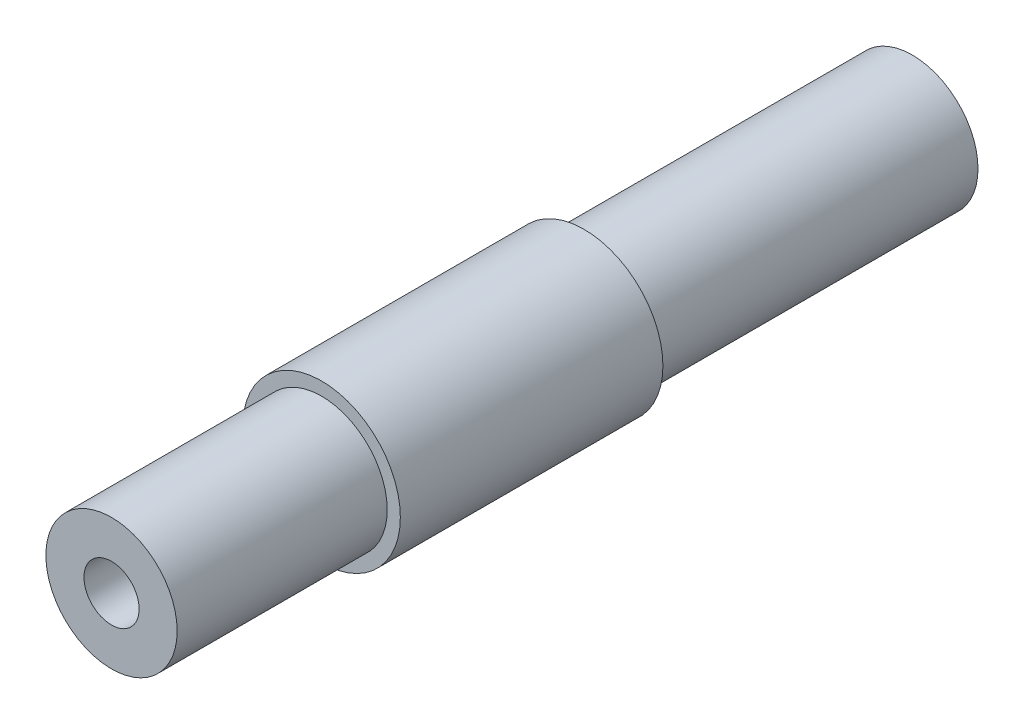
ISO-10303-21;
HEADER;
FILE_DESCRIPTION(('STEP AP214'),'2;1');
FILE_NAME('part.step','',(''),(''),'','','');
FILE_SCHEMA(('AUTOMOTIVE_DESIGN { 1 0 10303 214 1 1 1 1 }'));
ENDSEC;
DATA;
#1=APPLICATION_CONTEXT('core data for automotive mechanical design processes');
#2=APPLICATION_PROTOCOL_DEFINITION('international standard','automotive_design',2000,#1);
#3=PRODUCT_CONTEXT('',#1,'mechanical');
#4=PRODUCT('Part','Part','',(#3));
#5=PRODUCT_RELATED_PRODUCT_CATEGORY('part','',(#4));
#6=PRODUCT_DEFINITION_FORMATION('','',#4);
#7=PRODUCT_DEFINITION_CONTEXT('part definition',#1,'design');
#8=PRODUCT_DEFINITION('design','',#6,#7);
#9=PRODUCT_DEFINITION_SHAPE('','',#8);
#10=(LENGTH_UNIT() NAMED_UNIT(*) SI_UNIT(.MILLI.,.METRE.));
#11=(NAMED_UNIT(*) PLANE_ANGLE_UNIT() SI_UNIT($,.RADIAN.));
#12=(NAMED_UNIT(*) SI_UNIT($,.STERADIAN.) SOLID_ANGLE_UNIT());
#13=UNCERTAINTY_MEASURE_WITH_UNIT(LENGTH_MEASURE(1.E-05),#10,'distance_accuracy_value','');
#14=(GEOMETRIC_REPRESENTATION_CONTEXT(3) GLOBAL_UNCERTAINTY_ASSIGNED_CONTEXT((#13)) GLOBAL_UNIT_ASSIGNED_CONTEXT((#10,
#11,#12)) REPRESENTATION_CONTEXT('',''));
#15=CARTESIAN_POINT('',(0.,0.,0.));
#16=DIRECTION('',(0.,0.,1.));
#17=DIRECTION('',(1.,0.,0.));
#18=AXIS2_PLACEMENT_3D('',#15,#16,#17);
#19=CARTESIAN_POINT('',(0.,0.,0.));
#20=DIRECTION('',(0.,0.,1.));
#21=DIRECTION('',(1.,0.,0.));
#22=AXIS2_PLACEMENT_3D('',#19,#20,#21);
#23=PLANE('',#22);
#24=CARTESIAN_POINT('',(0.,0.,0.));
#25=DIRECTION('',(0.,0.,1.));
#26=DIRECTION('',(1.,0.,0.));
#27=AXIS2_PLACEMENT_3D('',#24,#25,#26);
#28=CIRCLE('',#27,6.);
#29=CARTESIAN_POINT('',(6.,0.,0.));
#30=VERTEX_POINT('',#29);
#31=EDGE_CURVE('E77',#30,#30,#28,.T.);
#32=ORIENTED_EDGE('',*,*,#31,.F.);
#33=EDGE_LOOP('',(#32));
#34=FACE_BOUND('',#33,.T.);
#35=CARTESIAN_POINT('',(0.,0.,0.));
#36=DIRECTION('',(0.,0.,1.));
#37=DIRECTION('',(1.,0.,0.));
#38=AXIS2_PLACEMENT_3D('',#35,#36,#37);
#39=CIRCLE('',#38,5.);
#40=CARTESIAN_POINT('',(5.,0.,0.));
#41=VERTEX_POINT('',#40);
#42=EDGE_CURVE('E11',#41,#41,#39,.F.);
#43=ORIENTED_EDGE('',*,*,#42,.F.);
#44=EDGE_LOOP('',(#43));
#45=FACE_BOUND('',#44,.T.);
#46=ADVANCED_FACE('F35',(#34,#45),#23,.F.);
#47=CARTESIAN_POINT('',(0.,0.,20.));
#48=DIRECTION('',(0.,0.,1.));
#49=DIRECTION('',(1.,0.,0.));
#50=AXIS2_PLACEMENT_3D('',#47,#48,#49);
#51=PLANE('',#50);
#52=CARTESIAN_POINT('',(0.,0.,20.));
#53=DIRECTION('',(0.,0.,1.));
#54=DIRECTION('',(1.,0.,0.));
#55=AXIS2_PLACEMENT_3D('',#52,#53,#54);
#56=CIRCLE('',#55,6.);
#57=CARTESIAN_POINT('',(6.,0.,20.));
#58=VERTEX_POINT('',#57);
#59=EDGE_CURVE('E43',#58,#58,#56,.T.);
#60=ORIENTED_EDGE('',*,*,#59,.T.);
#61=EDGE_LOOP('',(#60));
#62=FACE_BOUND('',#61,.T.);
#63=CARTESIAN_POINT('',(0.,0.,20.));
#64=DIRECTION('',(0.,0.,1.));
#65=DIRECTION('',(1.,0.,0.));
#66=AXIS2_PLACEMENT_3D('',#63,#64,#65);
#67=CIRCLE('',#66,5.);
#68=CARTESIAN_POINT('',(5.,0.,20.));
#69=VERTEX_POINT('',#68);
#70=EDGE_CURVE('E73',#69,#69,#67,.T.);
#71=ORIENTED_EDGE('',*,*,#70,.F.);
#72=EDGE_LOOP('',(#71));
#73=FACE_BOUND('',#72,.T.);
#74=ADVANCED_FACE('F87',(#62,#73),#51,.T.);
#75=CARTESIAN_POINT('',(0.,0.,20.));
#76=DIRECTION('',(0.,0.,-1.));
#77=DIRECTION('',(-1.,0.,0.));
#78=AXIS2_PLACEMENT_3D('',#75,#76,#77);
#79=CYLINDRICAL_SURFACE('',#78,6.);
#80=ORIENTED_EDGE('',*,*,#59,.F.);
#81=EDGE_LOOP('',(#80));
#82=FACE_BOUND('',#81,.T.);
#83=ORIENTED_EDGE('',*,*,#31,.T.);
#84=EDGE_LOOP('',(#83));
#85=FACE_BOUND('',#84,.T.);
#86=ADVANCED_FACE('F37',(#82,#85),#79,.T.);
#87=CARTESIAN_POINT('',(0.,0.,36.));
#88=DIRECTION('',(0.,0.,-1.));
#89=DIRECTION('',(-1.,0.,0.));
#90=AXIS2_PLACEMENT_3D('',#87,#88,#89);
#91=CYLINDRICAL_SURFACE('',#90,5.);
#92=CARTESIAN_POINT('',(0.,0.,36.));
#93=DIRECTION('',(0.,0.,1.));
#94=DIRECTION('',(1.,0.,0.));
#95=AXIS2_PLACEMENT_3D('',#92,#93,#94);
#96=CIRCLE('',#95,5.);
#97=CARTESIAN_POINT('',(5.,0.,36.));
#98=VERTEX_POINT('',#97);
#99=EDGE_CURVE('E74',#98,#98,#96,.T.);
#100=ORIENTED_EDGE('',*,*,#99,.F.);
#101=EDGE_LOOP('',(#100));
#102=FACE_BOUND('',#101,.T.);
#103=ORIENTED_EDGE('',*,*,#70,.T.);
#104=EDGE_LOOP('',(#103));
#105=FACE_BOUND('',#104,.T.);
#106=ADVANCED_FACE('F103',(#102,#105),#91,.T.);
#107=CARTESIAN_POINT('',(0.,0.,36.));
#108=DIRECTION('',(0.,0.,1.));
#109=DIRECTION('',(1.,0.,0.));
#110=AXIS2_PLACEMENT_3D('',#107,#108,#109);
#111=PLANE('',#110);
#112=CARTESIAN_POINT('',(0.,0.,36.));
#113=DIRECTION('',(0.,0.,1.));
#114=DIRECTION('',(1.,0.,0.));
#115=AXIS2_PLACEMENT_3D('',#112,#113,#114);
#116=CIRCLE('',#115,2.09999999999999);
#117=CARTESIAN_POINT('',(2.09999999999999,0.,36.));
#118=VERTEX_POINT('',#117);
#119=EDGE_CURVE('E60',#118,#118,#116,.T.);
#120=ORIENTED_EDGE('',*,*,#119,.F.);
#121=EDGE_LOOP('',(#120));
#122=FACE_BOUND('',#121,.T.);
#123=ORIENTED_EDGE('',*,*,#99,.T.);
#124=EDGE_LOOP('',(#123));
#125=FACE_BOUND('',#124,.T.);
#126=ADVANCED_FACE('F93',(#122,#125),#111,.T.);
#127=CARTESIAN_POINT('',(0.,0.,-25.));
#128=DIRECTION('',(0.,0.,1.));
#129=DIRECTION('',(1.,0.,0.));
#130=AXIS2_PLACEMENT_3D('',#127,#128,#129);
#131=CYLINDRICAL_SURFACE('',#130,5.);
#132=CARTESIAN_POINT('',(0.,0.,-25.));
#133=DIRECTION('',(0.,0.,-1.));
#134=DIRECTION('',(-1.,0.,0.));
#135=AXIS2_PLACEMENT_3D('',#132,#133,#134);
#136=CIRCLE('',#135,5.);
#137=CARTESIAN_POINT('',(-5.,0.,-25.));
#138=VERTEX_POINT('',#137);
#139=EDGE_CURVE('E70',#138,#138,#136,.T.);
#140=ORIENTED_EDGE('',*,*,#139,.F.);
#141=EDGE_LOOP('',(#140));
#142=FACE_BOUND('',#141,.T.);
#143=ORIENTED_EDGE('',*,*,#42,.T.);
#144=EDGE_LOOP('',(#143));
#145=FACE_BOUND('',#144,.T.);
#146=ADVANCED_FACE('F90',(#142,#145),#131,.T.);
#147=CARTESIAN_POINT('',(0.,0.,-25.));
#148=DIRECTION('',(0.,0.,-1.));
#149=DIRECTION('',(-1.,0.,0.));
#150=AXIS2_PLACEMENT_3D('',#147,#148,#149);
#151=PLANE('',#150);
#152=CARTESIAN_POINT('',(0.,0.,-25.));
#153=DIRECTION('',(0.,0.,-1.));
#154=DIRECTION('',(-1.,0.,0.));
#155=AXIS2_PLACEMENT_3D('',#152,#153,#154);
#156=CIRCLE('',#155,2.1);
#157=CARTESIAN_POINT('',(-2.1,0.,-25.));
#158=VERTEX_POINT('',#157);
#159=EDGE_CURVE('E59',#158,#158,#156,.T.);
#160=ORIENTED_EDGE('',*,*,#159,.F.);
#161=EDGE_LOOP('',(#160));
#162=FACE_BOUND('',#161,.T.);
#163=ORIENTED_EDGE('',*,*,#139,.T.);
#164=EDGE_LOOP('',(#163));
#165=FACE_BOUND('',#164,.T.);
#166=ADVANCED_FACE('F92',(#162,#165),#151,.T.);
#167=CARTESIAN_POINT('',(0.,0.,-12.6));
#168=DIRECTION('',(0.,0.,-1.));
#169=DIRECTION('',(-1.,0.,0.));
#170=AXIS2_PLACEMENT_3D('',#167,#168,#169);
#171=CONICAL_SURFACE('',#170,2.1,1.02974425867665);
#172=CARTESIAN_POINT('',(0.,0.,-11.3381927000421));
#173=VERTEX_POINT('',#172);
#174=VERTEX_LOOP('',#173);
#175=FACE_BOUND('',#174,.T.);
#176=CARTESIAN_POINT('',(0.,0.,-12.6));
#177=DIRECTION('',(0.,0.,-1.));
#178=DIRECTION('',(-1.,0.,0.));
#179=AXIS2_PLACEMENT_3D('',#176,#177,#178);
#180=CIRCLE('',#179,2.1);
#181=CARTESIAN_POINT('',(-2.1,0.,-12.6));
#182=VERTEX_POINT('',#181);
#183=EDGE_CURVE('E63',#182,#182,#180,.T.);
#184=ORIENTED_EDGE('',*,*,#183,.T.);
#185=EDGE_LOOP('',(#184));
#186=FACE_BOUND('',#185,.T.);
#187=ADVANCED_FACE('F100',(#175,#186),#171,.F.);
#188=CARTESIAN_POINT('',(0.,0.,-25.));
#189=DIRECTION('',(0.,0.,-1.));
#190=DIRECTION('',(-1.,0.,0.));
#191=AXIS2_PLACEMENT_3D('',#188,#189,#190);
#192=CYLINDRICAL_SURFACE('',#191,2.1);
#193=ORIENTED_EDGE('',*,*,#183,.F.);
#194=EDGE_LOOP('',(#193));
#195=FACE_BOUND('',#194,.T.);
#196=ORIENTED_EDGE('',*,*,#159,.T.);
#197=EDGE_LOOP('',(#196));
#198=FACE_BOUND('',#197,.T.);
#199=ADVANCED_FACE('F53',(#195,#198),#192,.F.);
#200=CARTESIAN_POINT('',(0.,0.,23.6));
#201=DIRECTION('',(0.,0.,1.));
#202=DIRECTION('',(1.,0.,0.));
#203=AXIS2_PLACEMENT_3D('',#200,#201,#202);
#204=CONICAL_SURFACE('',#203,2.09999999999999,1.02974425867665);
#205=CARTESIAN_POINT('',(0.,0.,22.3381927000421));
#206=VERTEX_POINT('',#205);
#207=VERTEX_LOOP('',#206);
#208=FACE_BOUND('',#207,.T.);
#209=CARTESIAN_POINT('',(0.,0.,23.6));
#210=DIRECTION('',(0.,0.,1.));
#211=DIRECTION('',(1.,0.,0.));
#212=AXIS2_PLACEMENT_3D('',#209,#210,#211);
#213=CIRCLE('',#212,2.09999999999999);
#214=CARTESIAN_POINT('',(2.09999999999999,0.,23.6));
#215=VERTEX_POINT('',#214);
#216=EDGE_CURVE('E57',#215,#215,#213,.T.);
#217=ORIENTED_EDGE('',*,*,#216,.T.);
#218=EDGE_LOOP('',(#217));
#219=FACE_BOUND('',#218,.T.);
#220=ADVANCED_FACE('F49',(#208,#219),#204,.F.);
#221=CARTESIAN_POINT('',(0.,0.,36.));
#222=DIRECTION('',(0.,0.,1.));
#223=DIRECTION('',(1.,0.,0.));
#224=AXIS2_PLACEMENT_3D('',#221,#222,#223);
#225=CYLINDRICAL_SURFACE('',#224,2.09999999999999);
#226=ORIENTED_EDGE('',*,*,#216,.F.);
#227=EDGE_LOOP('',(#226));
#228=FACE_BOUND('',#227,.T.);
#229=ORIENTED_EDGE('',*,*,#119,.T.);
#230=EDGE_LOOP('',(#229));
#231=FACE_BOUND('',#230,.T.);
#232=ADVANCED_FACE('F52',(#228,#231),#225,.F.);
#233=CLOSED_SHELL('',(#46,#74,#86,#106,#126,#146,#166,#187,#199,#220,#232));
#234=MANIFOLD_SOLID_BREP('B2',#233);
#235=ADVANCED_BREP_SHAPE_REPRESENTATION('',(#18,#234),#14);
#236=SHAPE_DEFINITION_REPRESENTATION(#9,#235);
ENDSEC;
END-ISO-10303-21;
